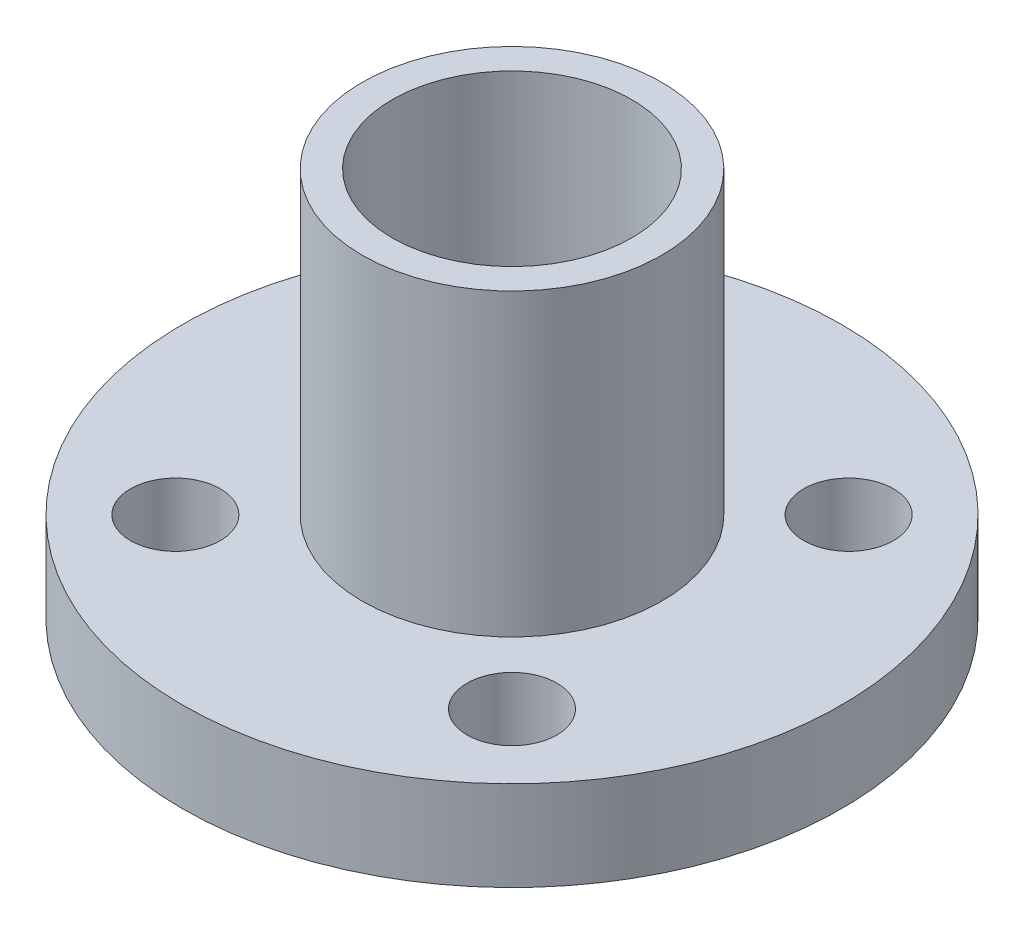
ISO-10303-21;
HEADER;
FILE_DESCRIPTION(('STEP AP214'),'2;1');
FILE_NAME('part.step','',(''),(''),'','','');
FILE_SCHEMA(('AUTOMOTIVE_DESIGN { 1 0 10303 214 1 1 1 1 }'));
ENDSEC;
DATA;
#1=APPLICATION_CONTEXT('core data for automotive mechanical design processes');
#2=APPLICATION_PROTOCOL_DEFINITION('international standard','automotive_design',2000,#1);
#3=PRODUCT_CONTEXT('',#1,'mechanical');
#4=PRODUCT('Part','Part','',(#3));
#5=PRODUCT_RELATED_PRODUCT_CATEGORY('part','',(#4));
#6=PRODUCT_DEFINITION_FORMATION('','',#4);
#7=PRODUCT_DEFINITION_CONTEXT('part definition',#1,'design');
#8=PRODUCT_DEFINITION('design','',#6,#7);
#9=PRODUCT_DEFINITION_SHAPE('','',#8);
#10=(LENGTH_UNIT() NAMED_UNIT(*) SI_UNIT(.MILLI.,.METRE.));
#11=(NAMED_UNIT(*) PLANE_ANGLE_UNIT() SI_UNIT($,.RADIAN.));
#12=(NAMED_UNIT(*) SI_UNIT($,.STERADIAN.) SOLID_ANGLE_UNIT());
#13=UNCERTAINTY_MEASURE_WITH_UNIT(LENGTH_MEASURE(1.E-05),#10,'distance_accuracy_value','');
#14=(GEOMETRIC_REPRESENTATION_CONTEXT(3) GLOBAL_UNCERTAINTY_ASSIGNED_CONTEXT((#13)) GLOBAL_UNIT_ASSIGNED_CONTEXT((#10,
#11,#12)) REPRESENTATION_CONTEXT('',''));
#15=CARTESIAN_POINT('',(0.,0.,0.));
#16=DIRECTION('',(0.,0.,1.));
#17=DIRECTION('',(1.,0.,0.));
#18=AXIS2_PLACEMENT_3D('',#15,#16,#17);
#19=CARTESIAN_POINT('',(0.,3.,0.));
#20=DIRECTION('',(0.,-1.,0.));
#21=DIRECTION('',(0.,0.,-1.));
#22=AXIS2_PLACEMENT_3D('',#19,#20,#21);
#23=CYLINDRICAL_SURFACE('',#22,11.);
#24=CARTESIAN_POINT('',(0.,3.,0.));
#25=DIRECTION('',(0.,1.,0.));
#26=DIRECTION('',(0.,0.,1.));
#27=AXIS2_PLACEMENT_3D('',#24,#25,#26);
#28=CIRCLE('',#27,11.);
#29=CARTESIAN_POINT('',(0.,3.,11.));
#30=VERTEX_POINT('',#29);
#31=EDGE_CURVE('E10',#30,#30,#28,.T.);
#32=ORIENTED_EDGE('',*,*,#31,.F.);
#33=EDGE_LOOP('',(#32));
#34=FACE_BOUND('',#33,.T.);
#35=CARTESIAN_POINT('',(0.,0.,0.));
#36=DIRECTION('',(0.,1.,0.));
#37=DIRECTION('',(0.,0.,1.));
#38=AXIS2_PLACEMENT_3D('',#35,#36,#37);
#39=CIRCLE('',#38,11.);
#40=CARTESIAN_POINT('',(0.,0.,11.));
#41=VERTEX_POINT('',#40);
#42=EDGE_CURVE('E47',#41,#41,#39,.T.);
#43=ORIENTED_EDGE('',*,*,#42,.T.);
#44=EDGE_LOOP('',(#43));
#45=FACE_BOUND('',#44,.T.);
#46=ADVANCED_FACE('F39',(#34,#45),#23,.T.);
#47=CARTESIAN_POINT('',(0.,3.,0.));
#48=DIRECTION('',(0.,1.,0.));
#49=DIRECTION('',(0.,0.,1.));
#50=AXIS2_PLACEMENT_3D('',#47,#48,#49);
#51=PLANE('',#50);
#52=CARTESIAN_POINT('',(0.,3.,0.));
#53=DIRECTION('',(0.,1.,0.));
#54=DIRECTION('',(0.,0.,1.));
#55=AXIS2_PLACEMENT_3D('',#52,#53,#54);
#56=CIRCLE('',#55,5.);
#57=CARTESIAN_POINT('',(0.,3.,5.));
#58=VERTEX_POINT('',#57);
#59=EDGE_CURVE('E118',#58,#58,#56,.T.);
#60=ORIENTED_EDGE('',*,*,#59,.F.);
#61=EDGE_LOOP('',(#60));
#62=FACE_BOUND('',#61,.T.);
#63=CARTESIAN_POINT('',(5.61770786724686,3.,-5.61770786724686));
#64=DIRECTION('',(0.,1.,0.));
#65=DIRECTION('',(0.,0.,1.));
#66=AXIS2_PLACEMENT_3D('',#63,#64,#65);
#67=CIRCLE('',#66,1.5);
#68=CARTESIAN_POINT('',(5.61770786724686,3.,-4.11770786724686));
#69=VERTEX_POINT('',#68);
#70=EDGE_CURVE('E137',#69,#69,#67,.T.);
#71=ORIENTED_EDGE('',*,*,#70,.F.);
#72=EDGE_LOOP('',(#71));
#73=FACE_BOUND('',#72,.T.);
#74=CARTESIAN_POINT('',(-5.61770786724686,3.,5.61770786724686));
#75=DIRECTION('',(0.,1.,0.));
#76=DIRECTION('',(0.,0.,1.));
#77=AXIS2_PLACEMENT_3D('',#74,#75,#76);
#78=CIRCLE('',#77,1.5);
#79=CARTESIAN_POINT('',(-5.61770786724686,3.,7.11770786724686));
#80=VERTEX_POINT('',#79);
#81=EDGE_CURVE('E136',#80,#80,#78,.T.);
#82=ORIENTED_EDGE('',*,*,#81,.F.);
#83=EDGE_LOOP('',(#82));
#84=FACE_BOUND('',#83,.T.);
#85=CARTESIAN_POINT('',(5.61770786724686,3.,5.61770786724686));
#86=DIRECTION('',(0.,1.,0.));
#87=DIRECTION('',(0.,0.,1.));
#88=AXIS2_PLACEMENT_3D('',#85,#86,#87);
#89=CIRCLE('',#88,1.5);
#90=CARTESIAN_POINT('',(5.61770786724686,3.,7.11770786724686));
#91=VERTEX_POINT('',#90);
#92=EDGE_CURVE('E131',#91,#91,#89,.T.);
#93=ORIENTED_EDGE('',*,*,#92,.F.);
#94=EDGE_LOOP('',(#93));
#95=FACE_BOUND('',#94,.T.);
#96=CARTESIAN_POINT('',(-5.61770786724686,3.,-5.61770786724686));
#97=DIRECTION('',(0.,1.,0.));
#98=DIRECTION('',(0.,0.,1.));
#99=AXIS2_PLACEMENT_3D('',#96,#97,#98);
#100=CIRCLE('',#99,1.5);
#101=CARTESIAN_POINT('',(-5.61770786724686,3.,-4.11770786724686));
#102=VERTEX_POINT('',#101);
#103=EDGE_CURVE('E55',#102,#102,#100,.T.);
#104=ORIENTED_EDGE('',*,*,#103,.F.);
#105=EDGE_LOOP('',(#104));
#106=FACE_BOUND('',#105,.T.);
#107=ORIENTED_EDGE('',*,*,#31,.T.);
#108=EDGE_LOOP('',(#107));
#109=FACE_BOUND('',#108,.T.);
#110=ADVANCED_FACE('F95',(#62,#73,#84,#95,#106,#109),#51,.T.);
#111=CARTESIAN_POINT('',(0.,0.,0.));
#112=DIRECTION('',(0.,1.,0.));
#113=DIRECTION('',(0.,0.,1.));
#114=AXIS2_PLACEMENT_3D('',#111,#112,#113);
#115=PLANE('',#114);
#116=CARTESIAN_POINT('',(0.,0.,0.));
#117=DIRECTION('',(0.,1.,0.));
#118=DIRECTION('',(0.,0.,1.));
#119=AXIS2_PLACEMENT_3D('',#116,#117,#118);
#120=CIRCLE('',#119,4.);
#121=CARTESIAN_POINT('',(0.,0.,4.));
#122=VERTEX_POINT('',#121);
#123=EDGE_CURVE('E115',#122,#122,#120,.T.);
#124=ORIENTED_EDGE('',*,*,#123,.T.);
#125=EDGE_LOOP('',(#124));
#126=FACE_BOUND('',#125,.T.);
#127=CARTESIAN_POINT('',(5.61770786724686,0.,-5.61770786724686));
#128=DIRECTION('',(0.,1.,0.));
#129=DIRECTION('',(0.,0.,1.));
#130=AXIS2_PLACEMENT_3D('',#127,#128,#129);
#131=CIRCLE('',#130,1.5);
#132=CARTESIAN_POINT('',(5.61770786724686,0.,-4.11770786724686));
#133=VERTEX_POINT('',#132);
#134=EDGE_CURVE('E42',#133,#133,#131,.T.);
#135=ORIENTED_EDGE('',*,*,#134,.T.);
#136=EDGE_LOOP('',(#135));
#137=FACE_BOUND('',#136,.T.);
#138=CARTESIAN_POINT('',(-5.61770786724686,0.,5.61770786724686));
#139=DIRECTION('',(0.,1.,0.));
#140=DIRECTION('',(0.,0.,1.));
#141=AXIS2_PLACEMENT_3D('',#138,#139,#140);
#142=CIRCLE('',#141,1.5);
#143=CARTESIAN_POINT('',(-5.61770786724686,0.,7.11770786724686));
#144=VERTEX_POINT('',#143);
#145=EDGE_CURVE('E65',#144,#144,#142,.T.);
#146=ORIENTED_EDGE('',*,*,#145,.T.);
#147=EDGE_LOOP('',(#146));
#148=FACE_BOUND('',#147,.T.);
#149=CARTESIAN_POINT('',(5.61770786724686,0.,5.61770786724686));
#150=DIRECTION('',(0.,1.,0.));
#151=DIRECTION('',(0.,0.,1.));
#152=AXIS2_PLACEMENT_3D('',#149,#150,#151);
#153=CIRCLE('',#152,1.5);
#154=CARTESIAN_POINT('',(5.61770786724686,0.,7.11770786724686));
#155=VERTEX_POINT('',#154);
#156=EDGE_CURVE('E62',#155,#155,#153,.T.);
#157=ORIENTED_EDGE('',*,*,#156,.T.);
#158=EDGE_LOOP('',(#157));
#159=FACE_BOUND('',#158,.T.);
#160=CARTESIAN_POINT('',(-5.61770786724686,0.,-5.61770786724686));
#161=DIRECTION('',(0.,1.,0.));
#162=DIRECTION('',(0.,0.,1.));
#163=AXIS2_PLACEMENT_3D('',#160,#161,#162);
#164=CIRCLE('',#163,1.5);
#165=CARTESIAN_POINT('',(-5.61770786724686,0.,-4.11770786724686));
#166=VERTEX_POINT('',#165);
#167=EDGE_CURVE('E58',#166,#166,#164,.T.);
#168=ORIENTED_EDGE('',*,*,#167,.T.);
#169=EDGE_LOOP('',(#168));
#170=FACE_BOUND('',#169,.T.);
#171=ORIENTED_EDGE('',*,*,#42,.F.);
#172=EDGE_LOOP('',(#171));
#173=FACE_BOUND('',#172,.T.);
#174=ADVANCED_FACE('F74',(#126,#137,#148,#159,#170,#173),#115,.F.);
#175=CARTESIAN_POINT('',(-5.61770786724686,-2.,-5.61770786724686));
#176=DIRECTION('',(0.,1.,0.));
#177=DIRECTION('',(0.,0.,1.));
#178=AXIS2_PLACEMENT_3D('',#175,#176,#177);
#179=CYLINDRICAL_SURFACE('',#178,1.5);
#180=ORIENTED_EDGE('',*,*,#103,.T.);
#181=EDGE_LOOP('',(#180));
#182=FACE_BOUND('',#181,.T.);
#183=ORIENTED_EDGE('',*,*,#167,.F.);
#184=EDGE_LOOP('',(#183));
#185=FACE_BOUND('',#184,.T.);
#186=ADVANCED_FACE('F106',(#182,#185),#179,.F.);
#187=CARTESIAN_POINT('',(5.61770786724686,-2.,5.61770786724686));
#188=DIRECTION('',(0.,1.,0.));
#189=DIRECTION('',(0.,0.,1.));
#190=AXIS2_PLACEMENT_3D('',#187,#188,#189);
#191=CYLINDRICAL_SURFACE('',#190,1.5);
#192=ORIENTED_EDGE('',*,*,#92,.T.);
#193=EDGE_LOOP('',(#192));
#194=FACE_BOUND('',#193,.T.);
#195=ORIENTED_EDGE('',*,*,#156,.F.);
#196=EDGE_LOOP('',(#195));
#197=FACE_BOUND('',#196,.T.);
#198=ADVANCED_FACE('F89',(#194,#197),#191,.F.);
#199=CARTESIAN_POINT('',(-5.61770786724686,-2.,5.61770786724686));
#200=DIRECTION('',(0.,1.,0.));
#201=DIRECTION('',(0.,0.,1.));
#202=AXIS2_PLACEMENT_3D('',#199,#200,#201);
#203=CYLINDRICAL_SURFACE('',#202,1.5);
#204=ORIENTED_EDGE('',*,*,#81,.T.);
#205=EDGE_LOOP('',(#204));
#206=FACE_BOUND('',#205,.T.);
#207=ORIENTED_EDGE('',*,*,#145,.F.);
#208=EDGE_LOOP('',(#207));
#209=FACE_BOUND('',#208,.T.);
#210=ADVANCED_FACE('F79',(#206,#209),#203,.F.);
#211=CARTESIAN_POINT('',(5.61770786724686,-2.,-5.61770786724686));
#212=DIRECTION('',(0.,1.,0.));
#213=DIRECTION('',(0.,0.,1.));
#214=AXIS2_PLACEMENT_3D('',#211,#212,#213);
#215=CYLINDRICAL_SURFACE('',#214,1.5);
#216=ORIENTED_EDGE('',*,*,#70,.T.);
#217=EDGE_LOOP('',(#216));
#218=FACE_BOUND('',#217,.T.);
#219=ORIENTED_EDGE('',*,*,#134,.F.);
#220=EDGE_LOOP('',(#219));
#221=FACE_BOUND('',#220,.T.);
#222=ADVANCED_FACE('F76',(#218,#221),#215,.F.);
#223=CARTESIAN_POINT('',(0.,13.,0.));
#224=DIRECTION('',(0.,-1.,0.));
#225=DIRECTION('',(0.,0.,-1.));
#226=AXIS2_PLACEMENT_3D('',#223,#224,#225);
#227=CYLINDRICAL_SURFACE('',#226,5.);
#228=CARTESIAN_POINT('',(0.,13.,0.));
#229=DIRECTION('',(0.,1.,0.));
#230=DIRECTION('',(0.,0.,1.));
#231=AXIS2_PLACEMENT_3D('',#228,#229,#230);
#232=CIRCLE('',#231,5.);
#233=CARTESIAN_POINT('',(0.,13.,5.));
#234=VERTEX_POINT('',#233);
#235=EDGE_CURVE('E124',#234,#234,#232,.T.);
#236=ORIENTED_EDGE('',*,*,#235,.F.);
#237=EDGE_LOOP('',(#236));
#238=FACE_BOUND('',#237,.T.);
#239=ORIENTED_EDGE('',*,*,#59,.T.);
#240=EDGE_LOOP('',(#239));
#241=FACE_BOUND('',#240,.T.);
#242=ADVANCED_FACE('F78',(#238,#241),#227,.T.);
#243=CARTESIAN_POINT('',(0.,13.,0.));
#244=DIRECTION('',(0.,1.,0.));
#245=DIRECTION('',(0.,0.,1.));
#246=AXIS2_PLACEMENT_3D('',#243,#244,#245);
#247=PLANE('',#246);
#248=CARTESIAN_POINT('',(0.,13.,0.));
#249=DIRECTION('',(0.,1.,0.));
#250=DIRECTION('',(0.,0.,1.));
#251=AXIS2_PLACEMENT_3D('',#248,#249,#250);
#252=CIRCLE('',#251,4.);
#253=CARTESIAN_POINT('',(0.,13.,4.));
#254=VERTEX_POINT('',#253);
#255=EDGE_CURVE('E119',#254,#254,#252,.T.);
#256=ORIENTED_EDGE('',*,*,#255,.F.);
#257=EDGE_LOOP('',(#256));
#258=FACE_BOUND('',#257,.T.);
#259=ORIENTED_EDGE('',*,*,#235,.T.);
#260=EDGE_LOOP('',(#259));
#261=FACE_BOUND('',#260,.T.);
#262=ADVANCED_FACE('F86',(#258,#261),#247,.T.);
#263=CARTESIAN_POINT('',(0.,0.,0.));
#264=DIRECTION('',(0.,1.,0.));
#265=DIRECTION('',(0.,0.,1.));
#266=AXIS2_PLACEMENT_3D('',#263,#264,#265);
#267=CYLINDRICAL_SURFACE('',#266,4.);
#268=ORIENTED_EDGE('',*,*,#123,.F.);
#269=EDGE_LOOP('',(#268));
#270=FACE_BOUND('',#269,.T.);
#271=ORIENTED_EDGE('',*,*,#255,.T.);
#272=EDGE_LOOP('',(#271));
#273=FACE_BOUND('',#272,.T.);
#274=ADVANCED_FACE('F163',(#270,#273),#267,.F.);
#275=CLOSED_SHELL('',(#46,#110,#174,#186,#198,#210,#222,#242,#262,#274));
#276=MANIFOLD_SOLID_BREP('B2',#275);
#277=ADVANCED_BREP_SHAPE_REPRESENTATION('',(#18,#276),#14);
#278=SHAPE_DEFINITION_REPRESENTATION(#9,#277);
ENDSEC;
END-ISO-10303-21;
